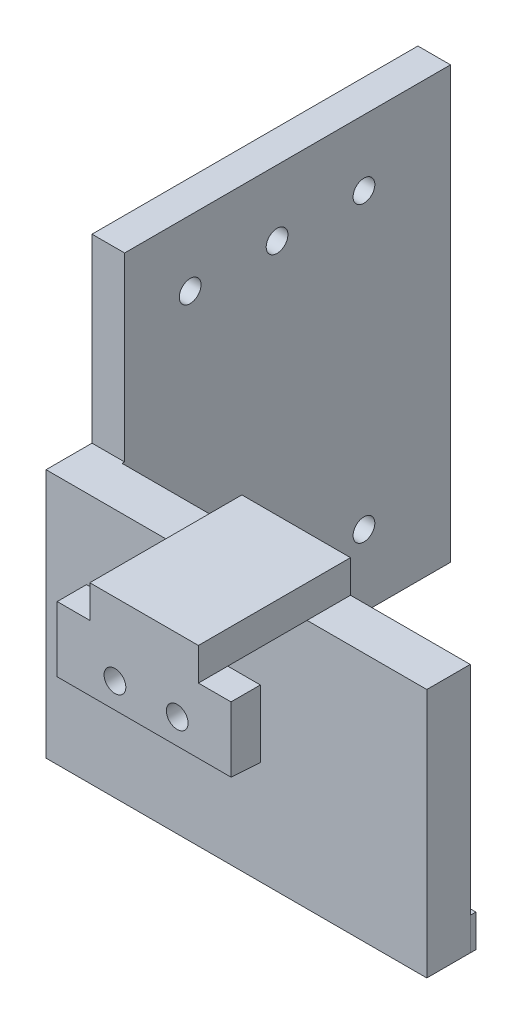
ISO-10303-21;
HEADER;
FILE_DESCRIPTION(('STEP AP214'),'2;1');
FILE_NAME('part.step','',(''),(''),'','','');
FILE_SCHEMA(('AUTOMOTIVE_DESIGN { 1 0 10303 214 1 1 1 1 }'));
ENDSEC;
DATA;
#1=APPLICATION_CONTEXT('core data for automotive mechanical design processes');
#2=APPLICATION_PROTOCOL_DEFINITION('international standard','automotive_design',2000,#1);
#3=PRODUCT_CONTEXT('',#1,'mechanical');
#4=PRODUCT('Part','Part','',(#3));
#5=PRODUCT_RELATED_PRODUCT_CATEGORY('part','',(#4));
#6=PRODUCT_DEFINITION_FORMATION('','',#4);
#7=PRODUCT_DEFINITION_CONTEXT('part definition',#1,'design');
#8=PRODUCT_DEFINITION('design','',#6,#7);
#9=PRODUCT_DEFINITION_SHAPE('','',#8);
#10=(LENGTH_UNIT() NAMED_UNIT(*) SI_UNIT(.MILLI.,.METRE.));
#11=(NAMED_UNIT(*) PLANE_ANGLE_UNIT() SI_UNIT($,.RADIAN.));
#12=(NAMED_UNIT(*) SI_UNIT($,.STERADIAN.) SOLID_ANGLE_UNIT());
#13=UNCERTAINTY_MEASURE_WITH_UNIT(LENGTH_MEASURE(1.E-05),#10,'distance_accuracy_value','');
#14=(GEOMETRIC_REPRESENTATION_CONTEXT(3) GLOBAL_UNCERTAINTY_ASSIGNED_CONTEXT((#13)) GLOBAL_UNIT_ASSIGNED_CONTEXT((#10,
#11,#12)) REPRESENTATION_CONTEXT('',''));
#15=CARTESIAN_POINT('',(0.,0.,0.));
#16=DIRECTION('',(0.,0.,1.));
#17=DIRECTION('',(1.,0.,0.));
#18=AXIS2_PLACEMENT_3D('',#15,#16,#17);
#19=CARTESIAN_POINT('',(-6.97071425240307,3.,-0.0426187268167585));
#20=DIRECTION('',(-0.999981310219043,0.,-0.00611385415309452));
#21=DIRECTION('',(-0.00611385415309452,0.,0.999981310219043));
#22=AXIS2_PLACEMENT_3D('',#19,#20,#21);
#23=PLANE('',#22);
#24=DIRECTION('',(0.,-1.,0.));
#25=VECTOR('',#24,1.);
#26=CARTESIAN_POINT('',(-6.90598064529182,3.,-10.6304403583716));
#27=LINE('',#26,#25);
#28=CARTESIAN_POINT('',(-6.90598064529182,3.,-10.6304403583716));
#29=VERTEX_POINT('',#28);
#30=CARTESIAN_POINT('',(-6.90598064529182,0.,-10.6304403583716));
#31=VERTEX_POINT('',#30);
#32=EDGE_CURVE('E50',#29,#31,#27,.T.);
#33=ORIENTED_EDGE('',*,*,#32,.F.);
#34=DIRECTION('',(0.00611385415309452,0.,-0.999981310219043));
#35=VECTOR('',#34,1.);
#36=CARTESIAN_POINT('',(-6.97071425240307,3.,-0.0426187268167585));
#37=LINE('',#36,#35);
#38=CARTESIAN_POINT('',(-6.90916357109715,3.,-10.1098413650964));
#39=VERTEX_POINT('',#38);
#40=EDGE_CURVE('E353',#39,#29,#37,.T.);
#41=ORIENTED_EDGE('',*,*,#40,.F.);
#42=DIRECTION('',(0.,-1.,0.));
#43=VECTOR('',#42,1.);
#44=CARTESIAN_POINT('',(-6.90916357109715,3.,-10.1098413650964));
#45=LINE('',#44,#43);
#46=CARTESIAN_POINT('',(-6.90916357109715,0.,-10.1098413650964));
#47=VERTEX_POINT('',#46);
#48=EDGE_CURVE('E43',#39,#47,#45,.T.);
#49=ORIENTED_EDGE('',*,*,#48,.T.);
#50=DIRECTION('',(0.00611385415309452,0.,-0.999981310219043));
#51=VECTOR('',#50,1.);
#52=CARTESIAN_POINT('',(-6.97071425240307,0.,-0.0426187268167585));
#53=LINE('',#52,#51);
#54=EDGE_CURVE('E350',#47,#31,#53,.T.);
#55=ORIENTED_EDGE('',*,*,#54,.T.);
#56=EDGE_LOOP('',(#33,#41,#49,#55));
#57=FACE_BOUND('',#56,.T.);
#58=ADVANCED_FACE('F35',(#57),#23,.F.);
#59=CARTESIAN_POINT('',(0.,3.,0.));
#60=DIRECTION('',(0.,1.,0.));
#61=DIRECTION('',(0.,0.,1.));
#62=AXIS2_PLACEMENT_3D('',#59,#60,#61);
#63=PLANE('',#62);
#64=ORIENTED_EDGE('',*,*,#40,.T.);
#65=DIRECTION('',(1.,0.,0.));
#66=VECTOR('',#65,1.);
#67=CARTESIAN_POINT('',(-6.75924540316802,3.,-10.6304403583716));
#68=LINE('',#67,#66);
#69=CARTESIAN_POINT('',(-38.959245403168,3.,-10.6304403583716));
#70=VERTEX_POINT('',#69);
#71=EDGE_CURVE('E228',#70,#29,#68,.T.);
#72=ORIENTED_EDGE('',*,*,#71,.F.);
#73=DIRECTION('',(0.,0.,1.));
#74=VECTOR('',#73,1.);
#75=CARTESIAN_POINT('',(-38.959245403168,3.,0.));
#76=LINE('',#75,#74);
#77=CARTESIAN_POINT('',(-38.959245403168,3.,-10.1098413650964));
#78=VERTEX_POINT('',#77);
#79=EDGE_CURVE('E351',#70,#78,#76,.T.);
#80=ORIENTED_EDGE('',*,*,#79,.T.);
#81=DIRECTION('',(-1.,0.,0.));
#82=VECTOR('',#81,1.);
#83=CARTESIAN_POINT('',(-6.90916357109715,3.,-10.1098413650964));
#84=LINE('',#83,#82);
#85=EDGE_CURVE('E317',#39,#78,#84,.T.);
#86=ORIENTED_EDGE('',*,*,#85,.F.);
#87=EDGE_LOOP('',(#64,#72,#80,#86));
#88=FACE_BOUND('',#87,.T.);
#89=ADVANCED_FACE('F441',(#88),#63,.T.);
#90=CARTESIAN_POINT('',(0.,0.,0.));
#91=DIRECTION('',(0.,1.,0.));
#92=DIRECTION('',(0.,0.,1.));
#93=AXIS2_PLACEMENT_3D('',#90,#91,#92);
#94=PLANE('',#93);
#95=DIRECTION('',(-1.,0.,0.));
#96=VECTOR('',#95,1.);
#97=CARTESIAN_POINT('',(0.,0.,-10.6304403583716));
#98=LINE('',#97,#96);
#99=CARTESIAN_POINT('',(-38.959245403168,0.,-10.6304403583716));
#100=VERTEX_POINT('',#99);
#101=EDGE_CURVE('E11',#31,#100,#98,.T.);
#102=ORIENTED_EDGE('',*,*,#101,.F.);
#103=ORIENTED_EDGE('',*,*,#54,.F.);
#104=DIRECTION('',(0.,0.,-1.));
#105=VECTOR('',#104,1.);
#106=CARTESIAN_POINT('',(-6.90916357109715,0.,-6.10984136509637));
#107=LINE('',#106,#105);
#108=CARTESIAN_POINT('',(-6.90916357109715,0.,-6.10984136509637));
#109=VERTEX_POINT('',#108);
#110=EDGE_CURVE('E347',#109,#47,#107,.T.);
#111=ORIENTED_EDGE('',*,*,#110,.F.);
#112=DIRECTION('',(1.,0.,0.));
#113=VECTOR('',#112,1.);
#114=CARTESIAN_POINT('',(-6.90916357109715,0.,-6.10984136509637));
#115=LINE('',#114,#113);
#116=CARTESIAN_POINT('',(-41.959245403168,0.,-6.10984136509637));
#117=VERTEX_POINT('',#116);
#118=EDGE_CURVE('E342',#117,#109,#115,.T.);
#119=ORIENTED_EDGE('',*,*,#118,.F.);
#120=DIRECTION('',(0.,0.,1.));
#121=VECTOR('',#120,1.);
#122=CARTESIAN_POINT('',(-41.959245403168,0.,-6.10984136509637));
#123=LINE('',#122,#121);
#124=CARTESIAN_POINT('',(-41.959245403168,0.,-40.3400117992578));
#125=VERTEX_POINT('',#124);
#126=EDGE_CURVE('E190',#125,#117,#123,.T.);
#127=ORIENTED_EDGE('',*,*,#126,.F.);
#128=DIRECTION('',(-1.,0.,0.));
#129=VECTOR('',#128,1.);
#130=CARTESIAN_POINT('',(-38.959245403168,0.,-40.3400117992578));
#131=LINE('',#130,#129);
#132=CARTESIAN_POINT('',(-38.959245403168,0.,-40.3400117992578));
#133=VERTEX_POINT('',#132);
#134=EDGE_CURVE('E184',#133,#125,#131,.T.);
#135=ORIENTED_EDGE('',*,*,#134,.F.);
#136=DIRECTION('',(0.,0.,1.));
#137=VECTOR('',#136,1.);
#138=CARTESIAN_POINT('',(-38.959245403168,0.,-40.3400117992578));
#139=LINE('',#138,#137);
#140=EDGE_CURVE('E188',#133,#100,#139,.T.);
#141=ORIENTED_EDGE('',*,*,#140,.T.);
#142=EDGE_LOOP('',(#102,#103,#111,#119,#127,#135,#141));
#143=FACE_BOUND('',#142,.T.);
#144=ADVANCED_FACE('F186',(#143),#94,.F.);
#145=CARTESIAN_POINT('',(-27.9342044871326,23.,-10.1098413650964));
#146=DIRECTION('',(-1.,0.,0.));
#147=DIRECTION('',(0.,0.,1.));
#148=AXIS2_PLACEMENT_3D('',#145,#146,#147);
#149=PLANE('',#148);
#150=DIRECTION('',(0.,0.,1.));
#151=VECTOR('',#150,1.);
#152=CARTESIAN_POINT('',(-27.9342044871326,23.,-10.1098413650964));
#153=LINE('',#152,#151);
#154=CARTESIAN_POINT('',(-27.9342044871326,23.,-6.10984136509637));
#155=VERTEX_POINT('',#154);
#156=CARTESIAN_POINT('',(-27.9342044871326,23.,1.1886888872823));
#157=VERTEX_POINT('',#156);
#158=EDGE_CURVE('E318',#155,#157,#153,.T.);
#159=ORIENTED_EDGE('',*,*,#158,.T.);
#160=DIRECTION('',(0.,0.,-1.));
#161=VECTOR('',#160,1.);
#162=CARTESIAN_POINT('',(-27.9342044871326,23.,1.1886888872823));
#163=LINE('',#162,#161);
#164=CARTESIAN_POINT('',(-27.9342044871326,23.,3.89015863490363));
#165=VERTEX_POINT('',#164);
#166=EDGE_CURVE('E243',#165,#157,#163,.T.);
#167=ORIENTED_EDGE('',*,*,#166,.F.);
#168=DIRECTION('',(0.,-1.,0.));
#169=VECTOR('',#168,1.);
#170=CARTESIAN_POINT('',(-27.9342044871326,23.,3.89015863490363));
#171=LINE('',#170,#169);
#172=CARTESIAN_POINT('',(-27.9342044871326,26.,3.89015863490363));
#173=VERTEX_POINT('',#172);
#174=EDGE_CURVE('E301',#173,#165,#171,.T.);
#175=ORIENTED_EDGE('',*,*,#174,.F.);
#176=DIRECTION('',(0.,0.,1.));
#177=VECTOR('',#176,1.);
#178=CARTESIAN_POINT('',(-27.9342044871326,26.,-10.1098413650964));
#179=LINE('',#178,#177);
#180=CARTESIAN_POINT('',(-27.9342044871326,26.,-10.1098413650964));
#181=VERTEX_POINT('',#180);
#182=EDGE_CURVE('E319',#181,#173,#179,.T.);
#183=ORIENTED_EDGE('',*,*,#182,.F.);
#184=DIRECTION('',(0.,-1.,0.));
#185=VECTOR('',#184,1.);
#186=CARTESIAN_POINT('',(-27.9342044871326,23.,-10.1098413650964));
#187=LINE('',#186,#185);
#188=CARTESIAN_POINT('',(-27.9342044871326,23.,-10.1098413650964));
#189=VERTEX_POINT('',#188);
#190=EDGE_CURVE('E310',#181,#189,#187,.T.);
#191=ORIENTED_EDGE('',*,*,#190,.T.);
#192=EDGE_CURVE('E314',#189,#155,#153,.T.);
#193=ORIENTED_EDGE('',*,*,#192,.T.);
#194=EDGE_LOOP('',(#159,#167,#175,#183,#191,#193));
#195=FACE_BOUND('',#194,.T.);
#196=ADVANCED_FACE('F469',(#195),#149,.T.);
#197=CARTESIAN_POINT('',(-17.9342044871326,26.,-10.1098413650964));
#198=DIRECTION('',(1.,0.,0.));
#199=DIRECTION('',(0.,0.,-1.));
#200=AXIS2_PLACEMENT_3D('',#197,#198,#199);
#201=PLANE('',#200);
#202=DIRECTION('',(0.,1.,0.));
#203=VECTOR('',#202,1.);
#204=CARTESIAN_POINT('',(-17.9342044871326,26.,3.89015863490363));
#205=LINE('',#204,#203);
#206=CARTESIAN_POINT('',(-17.9342044871326,23.,3.89015863490363));
#207=VERTEX_POINT('',#206);
#208=CARTESIAN_POINT('',(-17.9342044871326,26.,3.89015863490363));
#209=VERTEX_POINT('',#208);
#210=EDGE_CURVE('E294',#207,#209,#205,.T.);
#211=ORIENTED_EDGE('',*,*,#210,.F.);
#212=DIRECTION('',(0.,0.,1.));
#213=VECTOR('',#212,1.);
#214=CARTESIAN_POINT('',(-17.9342044871326,23.,1.1886888872823));
#215=LINE('',#214,#213);
#216=CARTESIAN_POINT('',(-17.9342044871326,23.,1.1886888872823));
#217=VERTEX_POINT('',#216);
#218=EDGE_CURVE('E272',#217,#207,#215,.T.);
#219=ORIENTED_EDGE('',*,*,#218,.F.);
#220=DIRECTION('',(0.,0.,1.));
#221=VECTOR('',#220,1.);
#222=CARTESIAN_POINT('',(-17.9342044871326,23.,-10.1098413650964));
#223=LINE('',#222,#221);
#224=CARTESIAN_POINT('',(-17.9342044871326,23.,-6.10984136509637));
#225=VERTEX_POINT('',#224);
#226=EDGE_CURVE('E313',#225,#217,#223,.T.);
#227=ORIENTED_EDGE('',*,*,#226,.F.);
#228=CARTESIAN_POINT('',(-17.9342044871326,23.,-10.1098413650964));
#229=VERTEX_POINT('',#228);
#230=EDGE_CURVE('E58',#229,#225,#223,.T.);
#231=ORIENTED_EDGE('',*,*,#230,.F.);
#232=DIRECTION('',(0.,1.,0.));
#233=VECTOR('',#232,1.);
#234=CARTESIAN_POINT('',(-17.9342044871326,26.,-10.1098413650964));
#235=LINE('',#234,#233);
#236=CARTESIAN_POINT('',(-17.9342044871326,26.,-10.1098413650964));
#237=VERTEX_POINT('',#236);
#238=EDGE_CURVE('E304',#229,#237,#235,.T.);
#239=ORIENTED_EDGE('',*,*,#238,.T.);
#240=DIRECTION('',(0.,0.,1.));
#241=VECTOR('',#240,1.);
#242=CARTESIAN_POINT('',(-17.9342044871326,26.,-10.1098413650964));
#243=LINE('',#242,#241);
#244=EDGE_CURVE('E321',#237,#209,#243,.T.);
#245=ORIENTED_EDGE('',*,*,#244,.T.);
#246=EDGE_LOOP('',(#211,#219,#227,#231,#239,#245));
#247=FACE_BOUND('',#246,.T.);
#248=ADVANCED_FACE('F486',(#247),#201,.T.);
#249=CARTESIAN_POINT('',(-22.9342044871326,23.,-10.1098413650964));
#250=DIRECTION('',(0.,-1.,0.));
#251=DIRECTION('',(0.,0.,-1.));
#252=AXIS2_PLACEMENT_3D('',#249,#250,#251);
#253=PLANE('',#252);
#254=ORIENTED_EDGE('',*,*,#226,.T.);
#255=DIRECTION('',(1.,0.,0.));
#256=VECTOR('',#255,1.);
#257=CARTESIAN_POINT('',(-17.9342044871326,23.,1.1886888872823));
#258=LINE('',#257,#256);
#259=EDGE_CURVE('E285',#157,#217,#258,.T.);
#260=ORIENTED_EDGE('',*,*,#259,.F.);
#261=ORIENTED_EDGE('',*,*,#158,.F.);
#262=DIRECTION('',(1.,0.,0.));
#263=VECTOR('',#262,1.);
#264=CARTESIAN_POINT('',(-38.959245403168,23.,-6.10984136509637));
#265=LINE('',#264,#263);
#266=EDGE_CURVE('E332',#155,#225,#265,.T.);
#267=ORIENTED_EDGE('',*,*,#266,.T.);
#268=EDGE_LOOP('',(#254,#260,#261,#267));
#269=FACE_BOUND('',#268,.T.);
#270=ADVANCED_FACE('F483',(#269),#253,.T.);
#271=CARTESIAN_POINT('',(0.,23.,0.));
#272=DIRECTION('',(0.,1.,0.));
#273=DIRECTION('',(0.,0.,1.));
#274=AXIS2_PLACEMENT_3D('',#271,#272,#273);
#275=PLANE('',#274);
#276=DIRECTION('',(-1.,0.,0.));
#277=VECTOR('',#276,1.);
#278=CARTESIAN_POINT('',(-6.90916357109715,23.,-10.1098413650964));
#279=LINE('',#278,#277);
#280=CARTESIAN_POINT('',(-6.90916357109715,23.,-10.1098413650964));
#281=VERTEX_POINT('',#280);
#282=EDGE_CURVE('E325',#281,#229,#279,.T.);
#283=ORIENTED_EDGE('',*,*,#282,.T.);
#284=ORIENTED_EDGE('',*,*,#230,.T.);
#285=CARTESIAN_POINT('',(-6.90916357109715,23.,-6.10984136509637));
#286=VERTEX_POINT('',#285);
#287=EDGE_CURVE('E327',#225,#286,#265,.T.);
#288=ORIENTED_EDGE('',*,*,#287,.T.);
#289=DIRECTION('',(0.,0.,-1.));
#290=VECTOR('',#289,1.);
#291=CARTESIAN_POINT('',(-6.90916357109715,23.,-6.10984136509637));
#292=LINE('',#291,#290);
#293=EDGE_CURVE('E331',#286,#281,#292,.T.);
#294=ORIENTED_EDGE('',*,*,#293,.T.);
#295=EDGE_LOOP('',(#283,#284,#288,#294));
#296=FACE_BOUND('',#295,.T.);
#297=ADVANCED_FACE('F474',(#296),#275,.T.);
#298=CARTESIAN_POINT('',(-6.90916357109715,3.,-6.10984136509637));
#299=DIRECTION('',(-1.,0.,0.));
#300=DIRECTION('',(0.,0.,1.));
#301=AXIS2_PLACEMENT_3D('',#298,#299,#300);
#302=PLANE('',#301);
#303=ORIENTED_EDGE('',*,*,#48,.F.);
#304=DIRECTION('',(0.,-1.,0.));
#305=VECTOR('',#304,1.);
#306=CARTESIAN_POINT('',(-6.90916357109715,23.,-10.1098413650964));
#307=LINE('',#306,#305);
#308=EDGE_CURVE('E334',#281,#39,#307,.T.);
#309=ORIENTED_EDGE('',*,*,#308,.F.);
#310=ORIENTED_EDGE('',*,*,#293,.F.);
#311=DIRECTION('',(0.,1.,0.));
#312=VECTOR('',#311,1.);
#313=CARTESIAN_POINT('',(-6.90916357109715,3.,-6.10984136509637));
#314=LINE('',#313,#312);
#315=EDGE_CURVE('E344',#109,#286,#314,.T.);
#316=ORIENTED_EDGE('',*,*,#315,.F.);
#317=ORIENTED_EDGE('',*,*,#110,.T.);
#318=EDGE_LOOP('',(#303,#309,#310,#316,#317));
#319=FACE_BOUND('',#318,.T.);
#320=ADVANCED_FACE('F447',(#319),#302,.F.);
#321=CARTESIAN_POINT('',(0.,0.,-6.10984136509637));
#322=DIRECTION('',(0.,0.,-1.));
#323=DIRECTION('',(-1.,0.,0.));
#324=AXIS2_PLACEMENT_3D('',#321,#322,#323);
#325=PLANE('',#324);
#326=CARTESIAN_POINT('',(-41.959245403168,23.,-6.10984136509637));
#327=VERTEX_POINT('',#326);
#328=EDGE_CURVE('E329',#327,#155,#265,.T.);
#329=ORIENTED_EDGE('',*,*,#328,.F.);
#330=DIRECTION('',(0.,1.,0.));
#331=VECTOR('',#330,1.);
#332=CARTESIAN_POINT('',(-41.959245403168,0.,-6.10984136509637));
#333=LINE('',#332,#331);
#334=EDGE_CURVE('E220',#117,#327,#333,.T.);
#335=ORIENTED_EDGE('',*,*,#334,.F.);
#336=ORIENTED_EDGE('',*,*,#118,.T.);
#337=ORIENTED_EDGE('',*,*,#315,.T.);
#338=ORIENTED_EDGE('',*,*,#287,.F.);
#339=ORIENTED_EDGE('',*,*,#266,.F.);
#340=EDGE_LOOP('',(#329,#335,#336,#337,#338,#339));
#341=FACE_BOUND('',#340,.T.);
#342=ADVANCED_FACE('F473',(#341),#325,.F.);
#343=CARTESIAN_POINT('',(-6.90916357109715,23.,-10.1098413650964));
#344=DIRECTION('',(0.,0.,1.));
#345=DIRECTION('',(1.,0.,0.));
#346=AXIS2_PLACEMENT_3D('',#343,#344,#345);
#347=PLANE('',#346);
#348=ORIENTED_EDGE('',*,*,#85,.T.);
#349=DIRECTION('',(0.,-1.,0.));
#350=VECTOR('',#349,1.);
#351=CARTESIAN_POINT('',(-38.959245403168,23.,-10.1098413650964));
#352=LINE('',#351,#350);
#353=CARTESIAN_POINT('',(-38.959245403168,23.,-10.1098413650964));
#354=VERTEX_POINT('',#353);
#355=EDGE_CURVE('E339',#354,#78,#352,.T.);
#356=ORIENTED_EDGE('',*,*,#355,.F.);
#357=EDGE_CURVE('E328',#189,#354,#279,.T.);
#358=ORIENTED_EDGE('',*,*,#357,.F.);
#359=ORIENTED_EDGE('',*,*,#190,.F.);
#360=DIRECTION('',(-1.,0.,0.));
#361=VECTOR('',#360,1.);
#362=CARTESIAN_POINT('',(-27.9342044871326,26.,-10.1098413650964));
#363=LINE('',#362,#361);
#364=EDGE_CURVE('E307',#237,#181,#363,.T.);
#365=ORIENTED_EDGE('',*,*,#364,.F.);
#366=ORIENTED_EDGE('',*,*,#238,.F.);
#367=ORIENTED_EDGE('',*,*,#282,.F.);
#368=ORIENTED_EDGE('',*,*,#308,.T.);
#369=EDGE_LOOP('',(#348,#356,#358,#359,#365,#366,#367,#368));
#370=FACE_BOUND('',#369,.T.);
#371=ADVANCED_FACE('F435',(#370),#347,.F.);
#372=ORIENTED_EDGE('',*,*,#192,.F.);
#373=ORIENTED_EDGE('',*,*,#357,.T.);
#374=DIRECTION('',(0.,0.,-1.));
#375=VECTOR('',#374,1.);
#376=CARTESIAN_POINT('',(-38.959245403168,23.,-6.10984136509637));
#377=LINE('',#376,#375);
#378=CARTESIAN_POINT('',(-38.959245403168,23.,-10.3400117992578));
#379=VERTEX_POINT('',#378);
#380=EDGE_CURVE('E210',#354,#379,#377,.T.);
#381=ORIENTED_EDGE('',*,*,#380,.T.);
#382=DIRECTION('',(1.,0.,0.));
#383=VECTOR('',#382,1.);
#384=CARTESIAN_POINT('',(-41.959245403168,23.,-10.3400117992578));
#385=LINE('',#384,#383);
#386=CARTESIAN_POINT('',(-41.959245403168,23.,-10.3400117992578));
#387=VERTEX_POINT('',#386);
#388=EDGE_CURVE('E224',#387,#379,#385,.T.);
#389=ORIENTED_EDGE('',*,*,#388,.F.);
#390=DIRECTION('',(0.,0.,-1.));
#391=VECTOR('',#390,1.);
#392=CARTESIAN_POINT('',(-41.959245403168,23.,-6.10984136509637));
#393=LINE('',#392,#391);
#394=EDGE_CURVE('E223',#327,#387,#393,.T.);
#395=ORIENTED_EDGE('',*,*,#394,.F.);
#396=ORIENTED_EDGE('',*,*,#328,.T.);
#397=EDGE_LOOP('',(#372,#373,#381,#389,#395,#396));
#398=FACE_BOUND('',#397,.T.);
#399=ADVANCED_FACE('F431',(#398),#275,.T.);
#400=CARTESIAN_POINT('',(-27.9342044871326,26.,-10.1098413650964));
#401=DIRECTION('',(0.,1.,0.));
#402=DIRECTION('',(0.,0.,1.));
#403=AXIS2_PLACEMENT_3D('',#400,#401,#402);
#404=PLANE('',#403);
#405=ORIENTED_EDGE('',*,*,#182,.T.);
#406=DIRECTION('',(-1.,0.,0.));
#407=VECTOR('',#406,1.);
#408=CARTESIAN_POINT('',(-27.9342044871326,26.,3.89015863490363));
#409=LINE('',#408,#407);
#410=EDGE_CURVE('E298',#209,#173,#409,.T.);
#411=ORIENTED_EDGE('',*,*,#410,.F.);
#412=ORIENTED_EDGE('',*,*,#244,.F.);
#413=ORIENTED_EDGE('',*,*,#364,.T.);
#414=EDGE_LOOP('',(#405,#411,#412,#413));
#415=FACE_BOUND('',#414,.T.);
#416=ADVANCED_FACE('F482',(#415),#404,.T.);
#417=CARTESIAN_POINT('',(0.,0.,3.89015863490363));
#418=DIRECTION('',(0.,0.,-1.));
#419=DIRECTION('',(-1.,0.,0.));
#420=AXIS2_PLACEMENT_3D('',#417,#418,#419);
#421=PLANE('',#420);
#422=CARTESIAN_POINT('',(-25.6169349493207,19.3234297248637,3.89015863490363));
#423=DIRECTION('',(0.,0.,1.));
#424=DIRECTION('',(1.,0.,0.));
#425=AXIS2_PLACEMENT_3D('',#422,#423,#424);
#426=CIRCLE('',#425,1.);
#427=CARTESIAN_POINT('',(-24.6169349493207,19.3234297248637,3.89015863490363));
#428=VERTEX_POINT('',#427);
#429=EDGE_CURVE('E233',#428,#428,#426,.T.);
#430=ORIENTED_EDGE('',*,*,#429,.F.);
#431=EDGE_LOOP('',(#430));
#432=FACE_BOUND('',#431,.T.);
#433=CARTESIAN_POINT('',(-19.8842044871326,19.3234297248637,3.89015863490363));
#434=DIRECTION('',(0.,0.,1.));
#435=DIRECTION('',(1.,0.,0.));
#436=AXIS2_PLACEMENT_3D('',#433,#434,#435);
#437=CIRCLE('',#436,1.);
#438=CARTESIAN_POINT('',(-18.8842044871326,19.3234297248637,3.89015863490363));
#439=VERTEX_POINT('',#438);
#440=EDGE_CURVE('E232',#439,#439,#437,.T.);
#441=ORIENTED_EDGE('',*,*,#440,.F.);
#442=EDGE_LOOP('',(#441));
#443=FACE_BOUND('',#442,.T.);
#444=ORIENTED_EDGE('',*,*,#174,.T.);
#445=DIRECTION('',(1.,0.,0.));
#446=VECTOR('',#445,1.);
#447=CARTESIAN_POINT('',(-30.9342044871326,23.,3.89015863490363));
#448=LINE('',#447,#446);
#449=CARTESIAN_POINT('',(-30.9342044871326,23.,3.89015863490363));
#450=VERTEX_POINT('',#449);
#451=EDGE_CURVE('E256',#450,#165,#448,.T.);
#452=ORIENTED_EDGE('',*,*,#451,.F.);
#453=DIRECTION('',(0.,1.,0.));
#454=VECTOR('',#453,1.);
#455=CARTESIAN_POINT('',(-30.9342044871326,23.,3.89015863490363));
#456=LINE('',#455,#454);
#457=CARTESIAN_POINT('',(-30.9342044871326,17.,3.89015863490363));
#458=VERTEX_POINT('',#457);
#459=EDGE_CURVE('E239',#458,#450,#456,.T.);
#460=ORIENTED_EDGE('',*,*,#459,.F.);
#461=DIRECTION('',(-1.,0.,0.));
#462=VECTOR('',#461,1.);
#463=CARTESIAN_POINT('',(-27.9342044871326,17.,3.89015863490363));
#464=LINE('',#463,#462);
#465=CARTESIAN_POINT('',(-17.9342044871326,17.,3.89015863490363));
#466=VERTEX_POINT('',#465);
#467=EDGE_CURVE('E292',#466,#458,#464,.T.);
#468=ORIENTED_EDGE('',*,*,#467,.F.);
#469=DIRECTION('',(-1.,0.,0.));
#470=VECTOR('',#469,1.);
#471=CARTESIAN_POINT('',(-14.9342044871326,17.,3.89015863490363));
#472=LINE('',#471,#470);
#473=CARTESIAN_POINT('',(-14.9342044871326,17.,3.89015863490363));
#474=VERTEX_POINT('',#473);
#475=EDGE_CURVE('E277',#474,#466,#472,.T.);
#476=ORIENTED_EDGE('',*,*,#475,.F.);
#477=DIRECTION('',(0.,-1.,0.));
#478=VECTOR('',#477,1.);
#479=CARTESIAN_POINT('',(-14.9342044871326,23.,3.89015863490363));
#480=LINE('',#479,#478);
#481=CARTESIAN_POINT('',(-14.9342044871326,23.,3.89015863490363));
#482=VERTEX_POINT('',#481);
#483=EDGE_CURVE('E265',#482,#474,#480,.T.);
#484=ORIENTED_EDGE('',*,*,#483,.F.);
#485=DIRECTION('',(-1.,0.,0.));
#486=VECTOR('',#485,1.);
#487=CARTESIAN_POINT('',(-14.9342044871326,23.,3.89015863490363));
#488=LINE('',#487,#486);
#489=EDGE_CURVE('E280',#482,#207,#488,.T.);
#490=ORIENTED_EDGE('',*,*,#489,.T.);
#491=ORIENTED_EDGE('',*,*,#210,.T.);
#492=ORIENTED_EDGE('',*,*,#410,.T.);
#493=EDGE_LOOP('',(#444,#452,#460,#468,#476,#484,#490,#491,#492));
#494=FACE_BOUND('',#493,.T.);
#495=ADVANCED_FACE('F493',(#432,#443,#494),#421,.F.);
#496=CARTESIAN_POINT('',(-17.9342044871326,17.,1.1886888872823));
#497=DIRECTION('',(0.,0.,1.));
#498=DIRECTION('',(1.,0.,0.));
#499=AXIS2_PLACEMENT_3D('',#496,#497,#498);
#500=PLANE('',#499);
#501=CARTESIAN_POINT('',(-25.6169349493207,19.3234297248637,1.1886888872823));
#502=DIRECTION('',(0.,0.,1.));
#503=DIRECTION('',(1.,0.,0.));
#504=AXIS2_PLACEMENT_3D('',#501,#502,#503);
#505=CIRCLE('',#504,1.);
#506=CARTESIAN_POINT('',(-24.6169349493207,19.3234297248637,1.1886888872823));
#507=VERTEX_POINT('',#506);
#508=EDGE_CURVE('E253',#507,#507,#505,.T.);
#509=ORIENTED_EDGE('',*,*,#508,.T.);
#510=EDGE_LOOP('',(#509));
#511=FACE_BOUND('',#510,.T.);
#512=CARTESIAN_POINT('',(-19.8842044871326,19.3234297248637,1.1886888872823));
#513=DIRECTION('',(0.,0.,1.));
#514=DIRECTION('',(1.,0.,0.));
#515=AXIS2_PLACEMENT_3D('',#512,#513,#514);
#516=CIRCLE('',#515,1.);
#517=CARTESIAN_POINT('',(-18.8842044871326,19.3234297248637,1.1886888872823));
#518=VERTEX_POINT('',#517);
#519=EDGE_CURVE('E236',#518,#518,#516,.T.);
#520=ORIENTED_EDGE('',*,*,#519,.T.);
#521=EDGE_LOOP('',(#520));
#522=FACE_BOUND('',#521,.T.);
#523=ORIENTED_EDGE('',*,*,#259,.T.);
#524=DIRECTION('',(-1.,0.,0.));
#525=VECTOR('',#524,1.);
#526=CARTESIAN_POINT('',(-14.9342044871326,23.,1.1886888872823));
#527=LINE('',#526,#525);
#528=CARTESIAN_POINT('',(-14.9342044871326,23.,1.1886888872823));
#529=VERTEX_POINT('',#528);
#530=EDGE_CURVE('E283',#529,#217,#527,.T.);
#531=ORIENTED_EDGE('',*,*,#530,.F.);
#532=DIRECTION('',(0.,1.,0.));
#533=VECTOR('',#532,1.);
#534=CARTESIAN_POINT('',(-14.9342044871326,16.8136844908418,1.1886888872823));
#535=LINE('',#534,#533);
#536=CARTESIAN_POINT('',(-14.9342044871326,16.8136844908418,1.1886888872823));
#537=VERTEX_POINT('',#536);
#538=EDGE_CURVE('E259',#537,#529,#535,.T.);
#539=ORIENTED_EDGE('',*,*,#538,.F.);
#540=DIRECTION('',(-1.,0.,0.));
#541=VECTOR('',#540,1.);
#542=CARTESIAN_POINT('',(-14.9342044871326,16.8136844908418,1.1886888872823));
#543=LINE('',#542,#541);
#544=CARTESIAN_POINT('',(-17.9342044871326,16.8136844908418,1.1886888872823));
#545=VERTEX_POINT('',#544);
#546=EDGE_CURVE('E269',#537,#545,#543,.T.);
#547=ORIENTED_EDGE('',*,*,#546,.T.);
#548=DIRECTION('',(0.,1.,0.));
#549=VECTOR('',#548,1.);
#550=CARTESIAN_POINT('',(-17.9342044871326,16.8136844908418,1.1886888872823));
#551=LINE('',#550,#549);
#552=CARTESIAN_POINT('',(-17.9342044871326,17.,1.1886888872823));
#553=VERTEX_POINT('',#552);
#554=EDGE_CURVE('E258',#545,#553,#551,.T.);
#555=ORIENTED_EDGE('',*,*,#554,.T.);
#556=DIRECTION('',(1.,0.,0.));
#557=VECTOR('',#556,1.);
#558=CARTESIAN_POINT('',(-17.9342044871326,17.,1.1886888872823));
#559=LINE('',#558,#557);
#560=CARTESIAN_POINT('',(-30.9342044871326,17.,1.1886888872823));
#561=VERTEX_POINT('',#560);
#562=EDGE_CURVE('E286',#561,#553,#559,.T.);
#563=ORIENTED_EDGE('',*,*,#562,.F.);
#564=DIRECTION('',(0.,-1.,0.));
#565=VECTOR('',#564,1.);
#566=CARTESIAN_POINT('',(-30.9342044871326,17.,1.1886888872823));
#567=LINE('',#566,#565);
#568=CARTESIAN_POINT('',(-30.9342044871326,23.,1.1886888872823));
#569=VERTEX_POINT('',#568);
#570=EDGE_CURVE('E245',#569,#561,#567,.T.);
#571=ORIENTED_EDGE('',*,*,#570,.F.);
#572=DIRECTION('',(1.,0.,0.));
#573=VECTOR('',#572,1.);
#574=CARTESIAN_POINT('',(-30.9342044871326,23.,1.1886888872823));
#575=LINE('',#574,#573);
#576=EDGE_CURVE('E251',#569,#157,#575,.T.);
#577=ORIENTED_EDGE('',*,*,#576,.T.);
#578=EDGE_LOOP('',(#523,#531,#539,#547,#555,#563,#571,#577));
#579=FACE_BOUND('',#578,.T.);
#580=ADVANCED_FACE('F500',(#511,#522,#579),#500,.F.);
#581=CARTESIAN_POINT('',(0.,17.,0.));
#582=DIRECTION('',(0.,1.,0.));
#583=DIRECTION('',(0.,0.,1.));
#584=AXIS2_PLACEMENT_3D('',#581,#582,#583);
#585=PLANE('',#584);
#586=ORIENTED_EDGE('',*,*,#467,.T.);
#587=DIRECTION('',(0.,0.,1.));
#588=VECTOR('',#587,1.);
#589=CARTESIAN_POINT('',(-30.9342044871326,17.,3.89015863490363));
#590=LINE('',#589,#588);
#591=EDGE_CURVE('E248',#561,#458,#590,.T.);
#592=ORIENTED_EDGE('',*,*,#591,.F.);
#593=ORIENTED_EDGE('',*,*,#562,.T.);
#594=DIRECTION('',(0.,0.,1.));
#595=VECTOR('',#594,1.);
#596=CARTESIAN_POINT('',(-17.9342044871326,17.,3.89015863490363));
#597=LINE('',#596,#595);
#598=EDGE_CURVE('E289',#553,#466,#597,.T.);
#599=ORIENTED_EDGE('',*,*,#598,.T.);
#600=EDGE_LOOP('',(#586,#592,#593,#599));
#601=FACE_BOUND('',#600,.T.);
#602=ADVANCED_FACE('F504',(#601),#585,.F.);
#603=CARTESIAN_POINT('',(-17.9342044871326,0.,0.));
#604=DIRECTION('',(1.,0.,0.));
#605=DIRECTION('',(0.,0.,-1.));
#606=AXIS2_PLACEMENT_3D('',#603,#604,#605);
#607=PLANE('',#606);
#608=DIRECTION('',(0.,-0.0688047565633486,-0.997630144629892));
#609=VECTOR('',#608,1.);
#610=CARTESIAN_POINT('',(-17.9342044871326,17.,3.89015863490363));
#611=LINE('',#610,#609);
#612=EDGE_CURVE('E263',#466,#545,#611,.T.);
#613=ORIENTED_EDGE('',*,*,#612,.F.);
#614=ORIENTED_EDGE('',*,*,#598,.F.);
#615=ORIENTED_EDGE('',*,*,#554,.F.);
#616=EDGE_LOOP('',(#613,#614,#615));
#617=FACE_BOUND('',#616,.T.);
#618=ADVANCED_FACE('F508',(#617),#607,.F.);
#619=CARTESIAN_POINT('',(-14.9342044871326,23.,1.1886888872823));
#620=DIRECTION('',(0.,-1.,0.));
#621=DIRECTION('',(0.,0.,-1.));
#622=AXIS2_PLACEMENT_3D('',#619,#620,#621);
#623=PLANE('',#622);
#624=ORIENTED_EDGE('',*,*,#218,.T.);
#625=ORIENTED_EDGE('',*,*,#489,.F.);
#626=DIRECTION('',(0.,0.,1.));
#627=VECTOR('',#626,1.);
#628=CARTESIAN_POINT('',(-14.9342044871326,23.,1.1886888872823));
#629=LINE('',#628,#627);
#630=EDGE_CURVE('E262',#529,#482,#629,.T.);
#631=ORIENTED_EDGE('',*,*,#630,.F.);
#632=ORIENTED_EDGE('',*,*,#530,.T.);
#633=EDGE_LOOP('',(#624,#625,#631,#632));
#634=FACE_BOUND('',#633,.T.);
#635=ADVANCED_FACE('F510',(#634),#623,.F.);
#636=CARTESIAN_POINT('',(-14.9342044871326,17.,3.89015863490363));
#637=DIRECTION('',(0.,0.997630144629892,-0.0688047565633486));
#638=DIRECTION('',(0.,0.0688047565633486,0.997630144629892));
#639=AXIS2_PLACEMENT_3D('',#636,#637,#638);
#640=PLANE('',#639);
#641=ORIENTED_EDGE('',*,*,#612,.T.);
#642=ORIENTED_EDGE('',*,*,#546,.F.);
#643=DIRECTION('',(0.,-0.0688047565633486,-0.997630144629892));
#644=VECTOR('',#643,1.);
#645=CARTESIAN_POINT('',(-14.9342044871326,17.,3.89015863490363));
#646=LINE('',#645,#644);
#647=EDGE_CURVE('E267',#474,#537,#646,.T.);
#648=ORIENTED_EDGE('',*,*,#647,.F.);
#649=ORIENTED_EDGE('',*,*,#475,.T.);
#650=EDGE_LOOP('',(#641,#642,#648,#649));
#651=FACE_BOUND('',#650,.T.);
#652=ADVANCED_FACE('F513',(#651),#640,.F.);
#653=CARTESIAN_POINT('',(-14.9342044871326,0.,0.));
#654=DIRECTION('',(1.,0.,0.));
#655=DIRECTION('',(0.,0.,-1.));
#656=AXIS2_PLACEMENT_3D('',#653,#654,#655);
#657=PLANE('',#656);
#658=ORIENTED_EDGE('',*,*,#538,.T.);
#659=ORIENTED_EDGE('',*,*,#630,.T.);
#660=ORIENTED_EDGE('',*,*,#483,.T.);
#661=ORIENTED_EDGE('',*,*,#647,.T.);
#662=EDGE_LOOP('',(#658,#659,#660,#661));
#663=FACE_BOUND('',#662,.T.);
#664=ADVANCED_FACE('F517',(#663),#657,.T.);
#665=CARTESIAN_POINT('',(-30.9342044871326,23.,1.1886888872823));
#666=DIRECTION('',(0.,-1.,0.));
#667=DIRECTION('',(0.,0.,-1.));
#668=AXIS2_PLACEMENT_3D('',#665,#666,#667);
#669=PLANE('',#668);
#670=ORIENTED_EDGE('',*,*,#166,.T.);
#671=ORIENTED_EDGE('',*,*,#576,.F.);
#672=DIRECTION('',(0.,0.,-1.));
#673=VECTOR('',#672,1.);
#674=CARTESIAN_POINT('',(-30.9342044871326,23.,1.1886888872823));
#675=LINE('',#674,#673);
#676=EDGE_CURVE('E242',#450,#569,#675,.T.);
#677=ORIENTED_EDGE('',*,*,#676,.F.);
#678=ORIENTED_EDGE('',*,*,#451,.T.);
#679=EDGE_LOOP('',(#670,#671,#677,#678));
#680=FACE_BOUND('',#679,.T.);
#681=ADVANCED_FACE('F524',(#680),#669,.F.);
#682=CARTESIAN_POINT('',(-30.9342044871326,0.,0.));
#683=DIRECTION('',(1.,0.,0.));
#684=DIRECTION('',(0.,0.,-1.));
#685=AXIS2_PLACEMENT_3D('',#682,#683,#684);
#686=PLANE('',#685);
#687=ORIENTED_EDGE('',*,*,#459,.T.);
#688=ORIENTED_EDGE('',*,*,#676,.T.);
#689=ORIENTED_EDGE('',*,*,#570,.T.);
#690=ORIENTED_EDGE('',*,*,#591,.T.);
#691=EDGE_LOOP('',(#687,#688,#689,#690));
#692=FACE_BOUND('',#691,.T.);
#693=ADVANCED_FACE('F528',(#692),#686,.F.);
#694=CARTESIAN_POINT('',(-19.8842044871326,19.3234297248637,-1.10984136509637));
#695=DIRECTION('',(0.,0.,1.));
#696=DIRECTION('',(1.,0.,0.));
#697=AXIS2_PLACEMENT_3D('',#694,#695,#696);
#698=CYLINDRICAL_SURFACE('',#697,1.);
#699=ORIENTED_EDGE('',*,*,#440,.T.);
#700=EDGE_LOOP('',(#699));
#701=FACE_BOUND('',#700,.T.);
#702=ORIENTED_EDGE('',*,*,#519,.F.);
#703=EDGE_LOOP('',(#702));
#704=FACE_BOUND('',#703,.T.);
#705=ADVANCED_FACE('F457',(#701,#704),#698,.F.);
#706=CARTESIAN_POINT('',(-25.6169349493207,19.3234297248637,-1.10984136509637));
#707=DIRECTION('',(0.,0.,1.));
#708=DIRECTION('',(1.,0.,0.));
#709=AXIS2_PLACEMENT_3D('',#706,#707,#708);
#710=CYLINDRICAL_SURFACE('',#709,1.);
#711=ORIENTED_EDGE('',*,*,#429,.T.);
#712=EDGE_LOOP('',(#711));
#713=FACE_BOUND('',#712,.T.);
#714=ORIENTED_EDGE('',*,*,#508,.F.);
#715=EDGE_LOOP('',(#714));
#716=FACE_BOUND('',#715,.T.);
#717=ADVANCED_FACE('F452',(#713,#716),#710,.F.);
#718=CARTESIAN_POINT('',(0.,0.,-10.6304403583716));
#719=DIRECTION('',(0.,0.,-1.));
#720=DIRECTION('',(-1.,0.,0.));
#721=AXIS2_PLACEMENT_3D('',#718,#719,#720);
#722=PLANE('',#721);
#723=DIRECTION('',(0.,1.,0.));
#724=VECTOR('',#723,1.);
#725=CARTESIAN_POINT('',(-38.959245403168,3.,-10.6304403583716));
#726=LINE('',#725,#724);
#727=EDGE_CURVE('E209',#100,#70,#726,.T.);
#728=ORIENTED_EDGE('',*,*,#727,.T.);
#729=ORIENTED_EDGE('',*,*,#71,.T.);
#730=ORIENTED_EDGE('',*,*,#32,.T.);
#731=ORIENTED_EDGE('',*,*,#101,.T.);
#732=EDGE_LOOP('',(#728,#729,#730,#731));
#733=FACE_BOUND('',#732,.T.);
#734=ADVANCED_FACE('F416',(#733),#722,.T.);
#735=CARTESIAN_POINT('',(-41.959245403168,0.,0.));
#736=DIRECTION('',(1.,0.,0.));
#737=DIRECTION('',(0.,0.,-1.));
#738=AXIS2_PLACEMENT_3D('',#735,#736,#737);
#739=PLANE('',#738);
#740=CARTESIAN_POINT('',(-41.959245403168,6.61038898625727,-32.3745132194218));
#741=DIRECTION('',(-1.,0.,0.));
#742=DIRECTION('',(0.,0.,1.));
#743=AXIS2_PLACEMENT_3D('',#740,#741,#742);
#744=CIRCLE('',#743,1.);
#745=CARTESIAN_POINT('',(-41.959245403168,6.61038898625727,-31.3745132194218));
#746=VERTEX_POINT('',#745);
#747=EDGE_CURVE('E396',#746,#746,#744,.T.);
#748=ORIENTED_EDGE('',*,*,#747,.F.);
#749=EDGE_LOOP('',(#748));
#750=FACE_BOUND('',#749,.T.);
#751=CARTESIAN_POINT('',(-41.959245403168,33.6103889862573,-16.3745132194218));
#752=DIRECTION('',(-1.,0.,0.));
#753=DIRECTION('',(0.,0.,1.));
#754=AXIS2_PLACEMENT_3D('',#751,#752,#753);
#755=CIRCLE('',#754,0.999999999999998);
#756=CARTESIAN_POINT('',(-41.959245403168,33.6103889862573,-15.3745132194218));
#757=VERTEX_POINT('',#756);
#758=EDGE_CURVE('E399',#757,#757,#755,.T.);
#759=ORIENTED_EDGE('',*,*,#758,.F.);
#760=EDGE_LOOP('',(#759));
#761=FACE_BOUND('',#760,.T.);
#762=CARTESIAN_POINT('',(-41.959245403168,33.6103889862573,-24.3745132194218));
#763=DIRECTION('',(-1.,0.,0.));
#764=DIRECTION('',(0.,0.,1.));
#765=AXIS2_PLACEMENT_3D('',#762,#763,#764);
#766=CIRCLE('',#765,0.999999999999998);
#767=CARTESIAN_POINT('',(-41.959245403168,33.6103889862573,-23.3745132194218));
#768=VERTEX_POINT('',#767);
#769=EDGE_CURVE('E402',#768,#768,#766,.T.);
#770=ORIENTED_EDGE('',*,*,#769,.F.);
#771=EDGE_LOOP('',(#770));
#772=FACE_BOUND('',#771,.T.);
#773=CARTESIAN_POINT('',(-41.959245403168,6.61038898625727,-16.3745132194218));
#774=DIRECTION('',(-1.,0.,0.));
#775=DIRECTION('',(0.,0.,1.));
#776=AXIS2_PLACEMENT_3D('',#773,#774,#775);
#777=CIRCLE('',#776,1.);
#778=CARTESIAN_POINT('',(-41.959245403168,6.61038898625727,-15.3745132194218));
#779=VERTEX_POINT('',#778);
#780=EDGE_CURVE('E405',#779,#779,#777,.T.);
#781=ORIENTED_EDGE('',*,*,#780,.F.);
#782=EDGE_LOOP('',(#781));
#783=FACE_BOUND('',#782,.T.);
#784=CARTESIAN_POINT('',(-41.959245403168,6.61038898625727,-24.3745132194218));
#785=DIRECTION('',(-1.,0.,0.));
#786=DIRECTION('',(0.,0.,1.));
#787=AXIS2_PLACEMENT_3D('',#784,#785,#786);
#788=CIRCLE('',#787,1.);
#789=CARTESIAN_POINT('',(-41.959245403168,6.61038898625727,-23.3745132194218));
#790=VERTEX_POINT('',#789);
#791=EDGE_CURVE('E395',#790,#790,#788,.T.);
#792=ORIENTED_EDGE('',*,*,#791,.F.);
#793=EDGE_LOOP('',(#792));
#794=FACE_BOUND('',#793,.T.);
#795=CARTESIAN_POINT('',(-41.959245403168,33.6103889862573,-32.3745132194218));
#796=DIRECTION('',(-1.,0.,0.));
#797=DIRECTION('',(0.,0.,1.));
#798=AXIS2_PLACEMENT_3D('',#795,#796,#797);
#799=CIRCLE('',#798,0.999999999999998);
#800=CARTESIAN_POINT('',(-41.959245403168,33.6103889862573,-31.3745132194218));
#801=VERTEX_POINT('',#800);
#802=EDGE_CURVE('E367',#801,#801,#799,.T.);
#803=ORIENTED_EDGE('',*,*,#802,.F.);
#804=EDGE_LOOP('',(#803));
#805=FACE_BOUND('',#804,.T.);
#806=ORIENTED_EDGE('',*,*,#126,.T.);
#807=ORIENTED_EDGE('',*,*,#334,.T.);
#808=ORIENTED_EDGE('',*,*,#394,.T.);
#809=DIRECTION('',(0.,1.,0.));
#810=VECTOR('',#809,1.);
#811=CARTESIAN_POINT('',(-41.959245403168,0.,-10.3400117992578));
#812=LINE('',#811,#810);
#813=CARTESIAN_POINT('',(-41.959245403168,39.6616599498714,-10.3400117992578));
#814=VERTEX_POINT('',#813);
#815=EDGE_CURVE('E384',#387,#814,#812,.T.);
#816=ORIENTED_EDGE('',*,*,#815,.T.);
#817=DIRECTION('',(0.,0.,1.));
#818=VECTOR('',#817,1.);
#819=CARTESIAN_POINT('',(-41.959245403168,39.6616599498714,-40.3400117992578));
#820=LINE('',#819,#818);
#821=CARTESIAN_POINT('',(-41.959245403168,39.6616599498714,-40.3400117992578));
#822=VERTEX_POINT('',#821);
#823=EDGE_CURVE('E211',#822,#814,#820,.T.);
#824=ORIENTED_EDGE('',*,*,#823,.F.);
#825=DIRECTION('',(0.,1.,0.));
#826=VECTOR('',#825,1.);
#827=CARTESIAN_POINT('',(-41.959245403168,0.,-40.3400117992578));
#828=LINE('',#827,#826);
#829=EDGE_CURVE('E193',#125,#822,#828,.T.);
#830=ORIENTED_EDGE('',*,*,#829,.F.);
#831=EDGE_LOOP('',(#806,#807,#808,#816,#824,#830));
#832=FACE_BOUND('',#831,.T.);
#833=ADVANCED_FACE('F413',(#750,#761,#772,#783,#794,#805,#832),#739,.F.);
#834=CARTESIAN_POINT('',(-38.959245403168,0.,0.));
#835=DIRECTION('',(1.,0.,0.));
#836=DIRECTION('',(0.,0.,-1.));
#837=AXIS2_PLACEMENT_3D('',#834,#835,#836);
#838=PLANE('',#837);
#839=CARTESIAN_POINT('',(-38.959245403168,6.61038898625727,-32.3745132194218));
#840=DIRECTION('',(1.,0.,0.));
#841=DIRECTION('',(0.,0.,-1.));
#842=AXIS2_PLACEMENT_3D('',#839,#840,#841);
#843=CIRCLE('',#842,1.);
#844=CARTESIAN_POINT('',(-38.959245403168,6.61038898625727,-33.3745132194218));
#845=VERTEX_POINT('',#844);
#846=EDGE_CURVE('E38',#845,#845,#843,.T.);
#847=ORIENTED_EDGE('',*,*,#846,.F.);
#848=EDGE_LOOP('',(#847));
#849=FACE_BOUND('',#848,.T.);
#850=CARTESIAN_POINT('',(-38.959245403168,33.6103889862573,-16.3745132194218));
#851=DIRECTION('',(1.,0.,0.));
#852=DIRECTION('',(0.,0.,-1.));
#853=AXIS2_PLACEMENT_3D('',#850,#851,#852);
#854=CIRCLE('',#853,0.999999999999998);
#855=CARTESIAN_POINT('',(-38.959245403168,33.6103889862573,-17.3745132194218));
#856=VERTEX_POINT('',#855);
#857=EDGE_CURVE('E375',#856,#856,#854,.T.);
#858=ORIENTED_EDGE('',*,*,#857,.F.);
#859=EDGE_LOOP('',(#858));
#860=FACE_BOUND('',#859,.T.);
#861=CARTESIAN_POINT('',(-38.959245403168,33.6103889862573,-24.3745132194218));
#862=DIRECTION('',(1.,0.,0.));
#863=DIRECTION('',(0.,0.,-1.));
#864=AXIS2_PLACEMENT_3D('',#861,#862,#863);
#865=CIRCLE('',#864,0.999999999999998);
#866=CARTESIAN_POINT('',(-38.959245403168,33.6103889862573,-25.3745132194218));
#867=VERTEX_POINT('',#866);
#868=EDGE_CURVE('E373',#867,#867,#865,.T.);
#869=ORIENTED_EDGE('',*,*,#868,.F.);
#870=EDGE_LOOP('',(#869));
#871=FACE_BOUND('',#870,.T.);
#872=CARTESIAN_POINT('',(-38.959245403168,6.61038898625727,-16.3745132194218));
#873=DIRECTION('',(1.,0.,0.));
#874=DIRECTION('',(0.,0.,-1.));
#875=AXIS2_PLACEMENT_3D('',#872,#873,#874);
#876=CIRCLE('',#875,1.);
#877=CARTESIAN_POINT('',(-38.959245403168,6.61038898625727,-17.3745132194218));
#878=VERTEX_POINT('',#877);
#879=EDGE_CURVE('E370',#878,#878,#876,.T.);
#880=ORIENTED_EDGE('',*,*,#879,.F.);
#881=EDGE_LOOP('',(#880));
#882=FACE_BOUND('',#881,.T.);
#883=CARTESIAN_POINT('',(-38.959245403168,6.61038898625727,-24.3745132194218));
#884=DIRECTION('',(1.,0.,0.));
#885=DIRECTION('',(0.,0.,-1.));
#886=AXIS2_PLACEMENT_3D('',#883,#884,#885);
#887=CIRCLE('',#886,1.);
#888=CARTESIAN_POINT('',(-38.959245403168,6.61038898625727,-25.3745132194218));
#889=VERTEX_POINT('',#888);
#890=EDGE_CURVE('E366',#889,#889,#887,.T.);
#891=ORIENTED_EDGE('',*,*,#890,.F.);
#892=EDGE_LOOP('',(#891));
#893=FACE_BOUND('',#892,.T.);
#894=CARTESIAN_POINT('',(-38.959245403168,33.6103889862573,-32.3745132194218));
#895=DIRECTION('',(1.,0.,0.));
#896=DIRECTION('',(0.,0.,-1.));
#897=AXIS2_PLACEMENT_3D('',#894,#895,#896);
#898=CIRCLE('',#897,0.999999999999998);
#899=CARTESIAN_POINT('',(-38.959245403168,33.6103889862573,-33.3745132194218));
#900=VERTEX_POINT('',#899);
#901=EDGE_CURVE('E363',#900,#900,#898,.T.);
#902=ORIENTED_EDGE('',*,*,#901,.F.);
#903=EDGE_LOOP('',(#902));
#904=FACE_BOUND('',#903,.T.);
#905=ORIENTED_EDGE('',*,*,#380,.F.);
#906=ORIENTED_EDGE('',*,*,#355,.T.);
#907=ORIENTED_EDGE('',*,*,#79,.F.);
#908=ORIENTED_EDGE('',*,*,#727,.F.);
#909=ORIENTED_EDGE('',*,*,#140,.F.);
#910=DIRECTION('',(0.,-1.,0.));
#911=VECTOR('',#910,1.);
#912=CARTESIAN_POINT('',(-38.959245403168,0.,-40.3400117992578));
#913=LINE('',#912,#911);
#914=CARTESIAN_POINT('',(-38.959245403168,39.6616599498714,-40.3400117992578));
#915=VERTEX_POINT('',#914);
#916=EDGE_CURVE('E194',#915,#133,#913,.T.);
#917=ORIENTED_EDGE('',*,*,#916,.F.);
#918=DIRECTION('',(0.,0.,1.));
#919=VECTOR('',#918,1.);
#920=CARTESIAN_POINT('',(-38.959245403168,39.6616599498714,-40.3400117992578));
#921=LINE('',#920,#919);
#922=CARTESIAN_POINT('',(-38.959245403168,39.6616599498714,-10.3400117992578));
#923=VERTEX_POINT('',#922);
#924=EDGE_CURVE('E215',#915,#923,#921,.T.);
#925=ORIENTED_EDGE('',*,*,#924,.T.);
#926=DIRECTION('',(0.,-1.,0.));
#927=VECTOR('',#926,1.);
#928=CARTESIAN_POINT('',(-38.959245403168,0.,-10.3400117992578));
#929=LINE('',#928,#927);
#930=EDGE_CURVE('E380',#923,#379,#929,.T.);
#931=ORIENTED_EDGE('',*,*,#930,.T.);
#932=EDGE_LOOP('',(#905,#906,#907,#908,#909,#917,#925,#931));
#933=FACE_BOUND('',#932,.T.);
#934=ADVANCED_FACE('F207',(#849,#860,#871,#882,#893,#904,#933),#838,.T.);
#935=CARTESIAN_POINT('',(-38.959245403168,39.6616599498714,-40.3400117992578));
#936=DIRECTION('',(0.,-1.,0.));
#937=DIRECTION('',(0.,0.,-1.));
#938=AXIS2_PLACEMENT_3D('',#935,#936,#937);
#939=PLANE('',#938);
#940=DIRECTION('',(1.,0.,0.));
#941=VECTOR('',#940,1.);
#942=CARTESIAN_POINT('',(-38.959245403168,39.6616599498714,-10.3400117992578));
#943=LINE('',#942,#941);
#944=EDGE_CURVE('E203',#814,#923,#943,.T.);
#945=ORIENTED_EDGE('',*,*,#944,.T.);
#946=ORIENTED_EDGE('',*,*,#924,.F.);
#947=DIRECTION('',(1.,0.,0.));
#948=VECTOR('',#947,1.);
#949=CARTESIAN_POINT('',(-38.959245403168,39.6616599498714,-40.3400117992578));
#950=LINE('',#949,#948);
#951=EDGE_CURVE('E199',#822,#915,#950,.T.);
#952=ORIENTED_EDGE('',*,*,#951,.F.);
#953=ORIENTED_EDGE('',*,*,#823,.T.);
#954=EDGE_LOOP('',(#945,#946,#952,#953));
#955=FACE_BOUND('',#954,.T.);
#956=ADVANCED_FACE('F426',(#955),#939,.F.);
#957=CARTESIAN_POINT('',(0.,0.,-40.3400117992578));
#958=DIRECTION('',(0.,0.,1.));
#959=DIRECTION('',(1.,0.,0.));
#960=AXIS2_PLACEMENT_3D('',#957,#958,#959);
#961=PLANE('',#960);
#962=ORIENTED_EDGE('',*,*,#916,.T.);
#963=ORIENTED_EDGE('',*,*,#134,.T.);
#964=ORIENTED_EDGE('',*,*,#829,.T.);
#965=ORIENTED_EDGE('',*,*,#951,.T.);
#966=EDGE_LOOP('',(#962,#963,#964,#965));
#967=FACE_BOUND('',#966,.T.);
#968=ADVANCED_FACE('F197',(#967),#961,.F.);
#969=CARTESIAN_POINT('',(0.,0.,-10.3400117992578));
#970=DIRECTION('',(0.,0.,1.));
#971=DIRECTION('',(1.,0.,0.));
#972=AXIS2_PLACEMENT_3D('',#969,#970,#971);
#973=PLANE('',#972);
#974=ORIENTED_EDGE('',*,*,#815,.F.);
#975=ORIENTED_EDGE('',*,*,#388,.T.);
#976=ORIENTED_EDGE('',*,*,#930,.F.);
#977=ORIENTED_EDGE('',*,*,#944,.F.);
#978=EDGE_LOOP('',(#974,#975,#976,#977));
#979=FACE_BOUND('',#978,.T.);
#980=ADVANCED_FACE('F428',(#979),#973,.T.);
#981=CARTESIAN_POINT('',(-11.959245403168,33.6103889862573,-32.3745132194218));
#982=DIRECTION('',(-1.,0.,0.));
#983=DIRECTION('',(0.,0.,1.));
#984=AXIS2_PLACEMENT_3D('',#981,#982,#983);
#985=CYLINDRICAL_SURFACE('',#984,0.999999999999998);
#986=ORIENTED_EDGE('',*,*,#901,.T.);
#987=EDGE_LOOP('',(#986));
#988=FACE_BOUND('',#987,.T.);
#989=ORIENTED_EDGE('',*,*,#802,.T.);
#990=EDGE_LOOP('',(#989));
#991=FACE_BOUND('',#990,.T.);
#992=ADVANCED_FACE('F704',(#988,#991),#985,.F.);
#993=CARTESIAN_POINT('',(-11.959245403168,6.61038898625727,-24.3745132194218));
#994=DIRECTION('',(-1.,0.,0.));
#995=DIRECTION('',(0.,0.,1.));
#996=AXIS2_PLACEMENT_3D('',#993,#994,#995);
#997=CYLINDRICAL_SURFACE('',#996,1.);
#998=ORIENTED_EDGE('',*,*,#890,.T.);
#999=EDGE_LOOP('',(#998));
#1000=FACE_BOUND('',#999,.T.);
#1001=ORIENTED_EDGE('',*,*,#791,.T.);
#1002=EDGE_LOOP('',(#1001));
#1003=FACE_BOUND('',#1002,.T.);
#1004=ADVANCED_FACE('F411',(#1000,#1003),#997,.F.);
#1005=CARTESIAN_POINT('',(-11.959245403168,6.61038898625727,-16.3745132194218));
#1006=DIRECTION('',(-1.,0.,0.));
#1007=DIRECTION('',(0.,0.,1.));
#1008=AXIS2_PLACEMENT_3D('',#1005,#1006,#1007);
#1009=CYLINDRICAL_SURFACE('',#1008,1.);
#1010=ORIENTED_EDGE('',*,*,#879,.T.);
#1011=EDGE_LOOP('',(#1010));
#1012=FACE_BOUND('',#1011,.T.);
#1013=ORIENTED_EDGE('',*,*,#780,.T.);
#1014=EDGE_LOOP('',(#1013));
#1015=FACE_BOUND('',#1014,.T.);
#1016=ADVANCED_FACE('F736',(#1012,#1015),#1009,.F.);
#1017=CARTESIAN_POINT('',(-11.959245403168,33.6103889862573,-24.3745132194218));
#1018=DIRECTION('',(-1.,0.,0.));
#1019=DIRECTION('',(0.,0.,1.));
#1020=AXIS2_PLACEMENT_3D('',#1017,#1018,#1019);
#1021=CYLINDRICAL_SURFACE('',#1020,0.999999999999998);
#1022=ORIENTED_EDGE('',*,*,#868,.T.);
#1023=EDGE_LOOP('',(#1022));
#1024=FACE_BOUND('',#1023,.T.);
#1025=ORIENTED_EDGE('',*,*,#769,.T.);
#1026=EDGE_LOOP('',(#1025));
#1027=FACE_BOUND('',#1026,.T.);
#1028=ADVANCED_FACE('F746',(#1024,#1027),#1021,.F.);
#1029=CARTESIAN_POINT('',(-11.959245403168,33.6103889862573,-16.3745132194218));
#1030=DIRECTION('',(-1.,0.,0.));
#1031=DIRECTION('',(0.,0.,1.));
#1032=AXIS2_PLACEMENT_3D('',#1029,#1030,#1031);
#1033=CYLINDRICAL_SURFACE('',#1032,0.999999999999998);
#1034=ORIENTED_EDGE('',*,*,#857,.T.);
#1035=EDGE_LOOP('',(#1034));
#1036=FACE_BOUND('',#1035,.T.);
#1037=ORIENTED_EDGE('',*,*,#758,.T.);
#1038=EDGE_LOOP('',(#1037));
#1039=FACE_BOUND('',#1038,.T.);
#1040=ADVANCED_FACE('F756',(#1036,#1039),#1033,.F.);
#1041=CARTESIAN_POINT('',(-11.959245403168,6.61038898625727,-32.3745132194218));
#1042=DIRECTION('',(-1.,0.,0.));
#1043=DIRECTION('',(0.,0.,1.));
#1044=AXIS2_PLACEMENT_3D('',#1041,#1042,#1043);
#1045=CYLINDRICAL_SURFACE('',#1044,1.);
#1046=ORIENTED_EDGE('',*,*,#846,.T.);
#1047=EDGE_LOOP('',(#1046));
#1048=FACE_BOUND('',#1047,.T.);
#1049=ORIENTED_EDGE('',*,*,#747,.T.);
#1050=EDGE_LOOP('',(#1049));
#1051=FACE_BOUND('',#1050,.T.);
#1052=ADVANCED_FACE('F766',(#1048,#1051),#1045,.F.);
#1053=CLOSED_SHELL('',(#58,#89,#144,#196,#248,#270,#297,#320,#342,#371,#399,#416,#495,#580,#602,
#618,#635,#652,#664,#681,#693,#705,#717,#734,#833,#934,#956,#968,#980,#992,#1004,#1016,#1028,
#1040,#1052));
#1054=MANIFOLD_SOLID_BREP('B2',#1053);
#1055=ADVANCED_BREP_SHAPE_REPRESENTATION('',(#18,#1054),#14);
#1056=SHAPE_DEFINITION_REPRESENTATION(#9,#1055);
ENDSEC;
END-ISO-10303-21;
